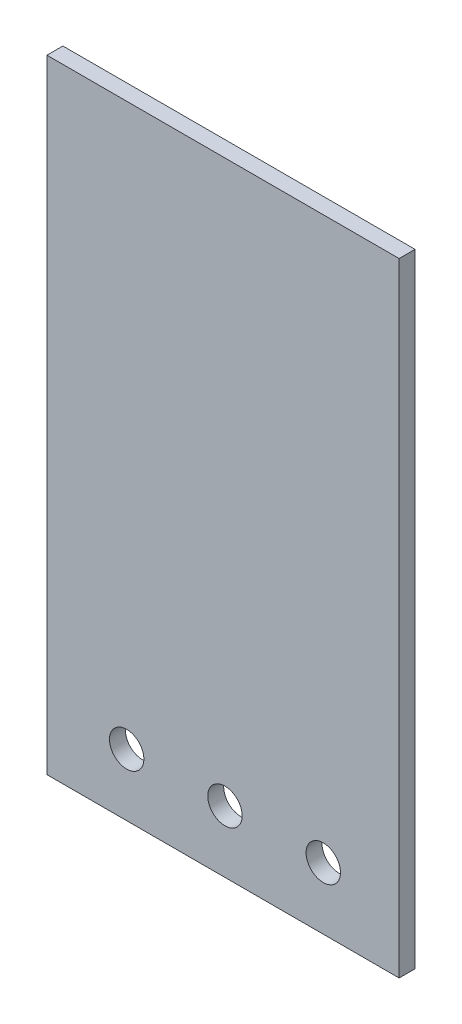
ISO-10303-21;
HEADER;
FILE_DESCRIPTION(('STEP AP214'),'2;1');
FILE_NAME('part.step','',(''),(''),'','','');
FILE_SCHEMA(('AUTOMOTIVE_DESIGN { 1 0 10303 214 1 1 1 1 }'));
ENDSEC;
DATA;
#1=APPLICATION_CONTEXT('core data for automotive mechanical design processes');
#2=APPLICATION_PROTOCOL_DEFINITION('international standard','automotive_design',2000,#1);
#3=PRODUCT_CONTEXT('',#1,'mechanical');
#4=PRODUCT('Part','Part','',(#3));
#5=PRODUCT_RELATED_PRODUCT_CATEGORY('part','',(#4));
#6=PRODUCT_DEFINITION_FORMATION('','',#4);
#7=PRODUCT_DEFINITION_CONTEXT('part definition',#1,'design');
#8=PRODUCT_DEFINITION('design','',#6,#7);
#9=PRODUCT_DEFINITION_SHAPE('','',#8);
#10=(LENGTH_UNIT() NAMED_UNIT(*) SI_UNIT(.MILLI.,.METRE.));
#11=(NAMED_UNIT(*) PLANE_ANGLE_UNIT() SI_UNIT($,.RADIAN.));
#12=(NAMED_UNIT(*) SI_UNIT($,.STERADIAN.) SOLID_ANGLE_UNIT());
#13=UNCERTAINTY_MEASURE_WITH_UNIT(LENGTH_MEASURE(1.E-05),#10,'distance_accuracy_value','');
#14=(GEOMETRIC_REPRESENTATION_CONTEXT(3) GLOBAL_UNCERTAINTY_ASSIGNED_CONTEXT((#13)) GLOBAL_UNIT_ASSIGNED_CONTEXT((#10,
#11,#12)) REPRESENTATION_CONTEXT('',''));
#15=CARTESIAN_POINT('',(0.,0.,0.));
#16=DIRECTION('',(0.,0.,1.));
#17=DIRECTION('',(1.,0.,0.));
#18=AXIS2_PLACEMENT_3D('',#15,#16,#17);
#19=CARTESIAN_POINT('',(0.,0.,0.41148));
#20=DIRECTION('',(0.,0.,-1.));
#21=DIRECTION('',(-1.,0.,0.));
#22=AXIS2_PLACEMENT_3D('',#19,#20,#21);
#23=PLANE('',#22);
#24=CARTESIAN_POINT('',(7.14000096,1.59999934,0.41148));
#25=DIRECTION('',(0.,0.,-1.));
#26=DIRECTION('',(-1.,0.,0.));
#27=AXIS2_PLACEMENT_3D('',#24,#25,#26);
#28=CIRCLE('',#27,0.4445);
#29=CARTESIAN_POINT('',(6.69550096,1.59999934,0.41148));
#30=VERTEX_POINT('',#29);
#31=EDGE_CURVE('E94',#30,#30,#28,.T.);
#32=ORIENTED_EDGE('',*,*,#31,.T.);
#33=EDGE_LOOP('',(#32));
#34=FACE_BOUND('',#33,.T.);
#35=CARTESIAN_POINT('',(4.60000096,1.59999934,0.41148));
#36=DIRECTION('',(0.,0.,-1.));
#37=DIRECTION('',(-1.,0.,0.));
#38=AXIS2_PLACEMENT_3D('',#35,#36,#37);
#39=CIRCLE('',#38,0.4445);
#40=CARTESIAN_POINT('',(4.15550096,1.59999934,0.41148));
#41=VERTEX_POINT('',#40);
#42=EDGE_CURVE('E97',#41,#41,#39,.T.);
#43=ORIENTED_EDGE('',*,*,#42,.T.);
#44=EDGE_LOOP('',(#43));
#45=FACE_BOUND('',#44,.T.);
#46=CARTESIAN_POINT('',(2.06000096,1.59999934,0.41148));
#47=DIRECTION('',(0.,0.,-1.));
#48=DIRECTION('',(-1.,0.,0.));
#49=AXIS2_PLACEMENT_3D('',#46,#47,#48);
#50=CIRCLE('',#49,0.4445);
#51=CARTESIAN_POINT('',(1.61550096,1.59999934,0.41148));
#52=VERTEX_POINT('',#51);
#53=EDGE_CURVE('E100',#52,#52,#50,.T.);
#54=ORIENTED_EDGE('',*,*,#53,.T.);
#55=EDGE_LOOP('',(#54));
#56=FACE_BOUND('',#55,.T.);
#57=DIRECTION('',(-1.57763917375398E-07,0.999999999999988,0.));
#58=VECTOR('',#57,1.);
#59=CARTESIAN_POINT('',(9.09999957999857,1.43565158185507E-06,0.41148));
#60=LINE('',#59,#58);
#61=CARTESIAN_POINT('',(9.09999958,-7.61999999999777E-06,0.41148));
#62=VERTEX_POINT('',#61);
#63=CARTESIAN_POINT('',(9.09999704,16.09999828,0.41148));
#64=VERTEX_POINT('',#63);
#65=EDGE_CURVE('E58',#62,#64,#60,.T.);
#66=ORIENTED_EDGE('',*,*,#65,.T.);
#67=DIRECTION('',(-0.999999999999649,8.37362675800606E-07,0.));
#68=VECTOR('',#67,1.);
#69=CARTESIAN_POINT('',(1.3481544020823E-05,16.1000058999866,0.41148));
#70=LINE('',#69,#68);
#71=CARTESIAN_POINT('',(-2.5400000001295E-06,16.1000059,0.41148));
#72=VERTEX_POINT('',#71);
#73=EDGE_CURVE('E55',#64,#72,#70,.T.);
#74=ORIENTED_EDGE('',*,*,#73,.T.);
#75=DIRECTION('',(1.57763917341198E-07,-0.999999999999988,0.));
#76=VECTOR('',#75,1.);
#77=CARTESIAN_POINT('',(0.,0.,0.41148));
#78=LINE('',#77,#76);
#79=CARTESIAN_POINT('',(0.,0.,0.41148));
#80=VERTEX_POINT('',#79);
#81=EDGE_CURVE('E19',#72,#80,#78,.T.);
#82=ORIENTED_EDGE('',*,*,#81,.T.);
#83=DIRECTION('',(0.999999999999649,-8.37362676009606E-07,0.));
#84=VECTOR('',#83,1.);
#85=CARTESIAN_POINT('',(0.,0.,0.41148));
#86=LINE('',#85,#84);
#87=EDGE_CURVE('E103',#80,#62,#86,.T.);
#88=ORIENTED_EDGE('',*,*,#87,.T.);
#89=EDGE_LOOP('',(#66,#74,#82,#88));
#90=FACE_BOUND('',#89,.T.);
#91=ADVANCED_FACE('F16',(#34,#45,#56,#90),#23,.F.);
#92=CARTESIAN_POINT('',(-2.54E-06,16.1000059,0.));
#93=DIRECTION('',(0.999999999999988,1.57763917341198E-07,0.));
#94=DIRECTION('',(-1.57763917341198E-07,0.999999999999988,0.));
#95=AXIS2_PLACEMENT_3D('',#92,#93,#94);
#96=PLANE('',#95);
#97=DIRECTION('',(0.,0.,1.));
#98=VECTOR('',#97,1.);
#99=CARTESIAN_POINT('',(0.,0.,0.));
#100=LINE('',#99,#98);
#101=CARTESIAN_POINT('',(0.,0.,0.));
#102=VERTEX_POINT('',#101);
#103=EDGE_CURVE('E67',#102,#80,#100,.T.);
#104=ORIENTED_EDGE('',*,*,#103,.T.);
#105=ORIENTED_EDGE('',*,*,#81,.F.);
#106=DIRECTION('',(0.,0.,1.));
#107=VECTOR('',#106,1.);
#108=CARTESIAN_POINT('',(-2.540000000259E-06,16.1000059,0.));
#109=LINE('',#108,#107);
#110=CARTESIAN_POINT('',(-2.54000000019425E-06,16.1000059,0.));
#111=VERTEX_POINT('',#110);
#112=EDGE_CURVE('E62',#72,#111,#109,.F.);
#113=ORIENTED_EDGE('',*,*,#112,.T.);
#114=DIRECTION('',(-1.57763917341198E-07,0.999999999999988,0.));
#115=VECTOR('',#114,1.);
#116=CARTESIAN_POINT('',(-2.54E-06,16.1000059,0.));
#117=LINE('',#116,#115);
#118=EDGE_CURVE('E92',#102,#111,#117,.T.);
#119=ORIENTED_EDGE('',*,*,#118,.F.);
#120=EDGE_LOOP('',(#104,#105,#113,#119));
#121=FACE_BOUND('',#120,.T.);
#122=ADVANCED_FACE('F64',(#121),#96,.F.);
#123=CARTESIAN_POINT('',(9.09999704,16.09999828,0.));
#124=DIRECTION('',(-8.37362675800606E-07,-0.999999999999649,0.));
#125=DIRECTION('',(0.999999999999649,-8.37362675800606E-07,0.));
#126=AXIS2_PLACEMENT_3D('',#123,#124,#125);
#127=PLANE('',#126);
#128=ORIENTED_EDGE('',*,*,#112,.F.);
#129=ORIENTED_EDGE('',*,*,#73,.F.);
#130=DIRECTION('',(0.,0.,1.));
#131=VECTOR('',#130,1.);
#132=CARTESIAN_POINT('',(9.09999704,16.09999828,0.));
#133=LINE('',#132,#131);
#134=CARTESIAN_POINT('',(9.09999704,16.09999828,0.));
#135=VERTEX_POINT('',#134);
#136=EDGE_CURVE('E75',#64,#135,#133,.F.);
#137=ORIENTED_EDGE('',*,*,#136,.T.);
#138=DIRECTION('',(0.999999999999649,-8.37362675800606E-07,0.));
#139=VECTOR('',#138,1.);
#140=CARTESIAN_POINT('',(9.09999704,16.09999828,0.));
#141=LINE('',#140,#139);
#142=EDGE_CURVE('E71',#111,#135,#141,.T.);
#143=ORIENTED_EDGE('',*,*,#142,.F.);
#144=EDGE_LOOP('',(#128,#129,#137,#143));
#145=FACE_BOUND('',#144,.T.);
#146=ADVANCED_FACE('F69',(#145),#127,.F.);
#147=CARTESIAN_POINT('',(9.09999958,-7.62E-06,0.));
#148=DIRECTION('',(-0.999999999999988,-1.57763917375398E-07,0.));
#149=DIRECTION('',(1.57763917375398E-07,-0.999999999999988,0.));
#150=AXIS2_PLACEMENT_3D('',#147,#148,#149);
#151=PLANE('',#150);
#152=ORIENTED_EDGE('',*,*,#136,.F.);
#153=ORIENTED_EDGE('',*,*,#65,.F.);
#154=DIRECTION('',(0.,0.,1.));
#155=VECTOR('',#154,1.);
#156=CARTESIAN_POINT('',(9.09999958,-7.61999999999777E-06,0.));
#157=LINE('',#156,#155);
#158=CARTESIAN_POINT('',(9.09999958,-7.61999999999777E-06,0.));
#159=VERTEX_POINT('',#158);
#160=EDGE_CURVE('E34',#62,#159,#157,.F.);
#161=ORIENTED_EDGE('',*,*,#160,.T.);
#162=DIRECTION('',(1.57763917375398E-07,-0.999999999999988,0.));
#163=VECTOR('',#162,1.);
#164=CARTESIAN_POINT('',(9.09999958,-7.62E-06,0.));
#165=LINE('',#164,#163);
#166=EDGE_CURVE('E88',#135,#159,#165,.T.);
#167=ORIENTED_EDGE('',*,*,#166,.F.);
#168=EDGE_LOOP('',(#152,#153,#161,#167));
#169=FACE_BOUND('',#168,.T.);
#170=ADVANCED_FACE('F105',(#169),#151,.F.);
#171=CARTESIAN_POINT('',(0.,0.,0.));
#172=DIRECTION('',(8.37362676009606E-07,0.999999999999649,0.));
#173=DIRECTION('',(-0.999999999999649,8.37362676009606E-07,0.));
#174=AXIS2_PLACEMENT_3D('',#171,#172,#173);
#175=PLANE('',#174);
#176=ORIENTED_EDGE('',*,*,#160,.F.);
#177=ORIENTED_EDGE('',*,*,#87,.F.);
#178=ORIENTED_EDGE('',*,*,#103,.F.);
#179=DIRECTION('',(-0.999999999999649,8.37362676009606E-07,0.));
#180=VECTOR('',#179,1.);
#181=CARTESIAN_POINT('',(0.,0.,0.));
#182=LINE('',#181,#180);
#183=EDGE_CURVE('E85',#159,#102,#182,.T.);
#184=ORIENTED_EDGE('',*,*,#183,.F.);
#185=EDGE_LOOP('',(#176,#177,#178,#184));
#186=FACE_BOUND('',#185,.T.);
#187=ADVANCED_FACE('F109',(#186),#175,.F.);
#188=CARTESIAN_POINT('',(2.06000096,1.59999934,0.));
#189=DIRECTION('',(0.,0.,-1.));
#190=DIRECTION('',(-1.,0.,0.));
#191=AXIS2_PLACEMENT_3D('',#188,#189,#190);
#192=CYLINDRICAL_SURFACE('',#191,0.4445);
#193=ORIENTED_EDGE('',*,*,#53,.F.);
#194=EDGE_LOOP('',(#193));
#195=FACE_BOUND('',#194,.T.);
#196=CARTESIAN_POINT('',(2.06000096,1.59999934,0.));
#197=DIRECTION('',(0.,0.,-1.));
#198=DIRECTION('',(-1.,0.,0.));
#199=AXIS2_PLACEMENT_3D('',#196,#197,#198);
#200=CIRCLE('',#199,0.4445);
#201=CARTESIAN_POINT('',(1.61550096,1.59999934,0.));
#202=VERTEX_POINT('',#201);
#203=EDGE_CURVE('E82',#202,#202,#200,.F.);
#204=ORIENTED_EDGE('',*,*,#203,.F.);
#205=EDGE_LOOP('',(#204));
#206=FACE_BOUND('',#205,.T.);
#207=ADVANCED_FACE('F111',(#195,#206),#192,.F.);
#208=CARTESIAN_POINT('',(4.60000096,1.59999934,0.));
#209=DIRECTION('',(0.,0.,-1.));
#210=DIRECTION('',(-1.,0.,0.));
#211=AXIS2_PLACEMENT_3D('',#208,#209,#210);
#212=CYLINDRICAL_SURFACE('',#211,0.4445);
#213=ORIENTED_EDGE('',*,*,#42,.F.);
#214=EDGE_LOOP('',(#213));
#215=FACE_BOUND('',#214,.T.);
#216=CARTESIAN_POINT('',(4.60000096,1.59999934,0.));
#217=DIRECTION('',(0.,0.,-1.));
#218=DIRECTION('',(-1.,0.,0.));
#219=AXIS2_PLACEMENT_3D('',#216,#217,#218);
#220=CIRCLE('',#219,0.4445);
#221=CARTESIAN_POINT('',(4.15550096,1.59999934,0.));
#222=VERTEX_POINT('',#221);
#223=EDGE_CURVE('E25',#222,#222,#220,.F.);
#224=ORIENTED_EDGE('',*,*,#223,.F.);
#225=EDGE_LOOP('',(#224));
#226=FACE_BOUND('',#225,.T.);
#227=ADVANCED_FACE('F118',(#215,#226),#212,.F.);
#228=CARTESIAN_POINT('',(7.14000096,1.59999934,0.));
#229=DIRECTION('',(0.,0.,-1.));
#230=DIRECTION('',(-1.,0.,0.));
#231=AXIS2_PLACEMENT_3D('',#228,#229,#230);
#232=CYLINDRICAL_SURFACE('',#231,0.4445);
#233=ORIENTED_EDGE('',*,*,#31,.F.);
#234=EDGE_LOOP('',(#233));
#235=FACE_BOUND('',#234,.T.);
#236=CARTESIAN_POINT('',(7.14000096,1.59999934,0.));
#237=DIRECTION('',(0.,0.,-1.));
#238=DIRECTION('',(-1.,0.,0.));
#239=AXIS2_PLACEMENT_3D('',#236,#237,#238);
#240=CIRCLE('',#239,0.4445);
#241=CARTESIAN_POINT('',(6.69550096,1.59999934,0.));
#242=VERTEX_POINT('',#241);
#243=EDGE_CURVE('E11',#242,#242,#240,.F.);
#244=ORIENTED_EDGE('',*,*,#243,.F.);
#245=EDGE_LOOP('',(#244));
#246=FACE_BOUND('',#245,.T.);
#247=ADVANCED_FACE('F123',(#235,#246),#232,.F.);
#248=CARTESIAN_POINT('',(0.,0.,0.));
#249=DIRECTION('',(0.,0.,-1.));
#250=DIRECTION('',(-1.,0.,0.));
#251=AXIS2_PLACEMENT_3D('',#248,#249,#250);
#252=PLANE('',#251);
#253=ORIENTED_EDGE('',*,*,#243,.T.);
#254=EDGE_LOOP('',(#253));
#255=FACE_BOUND('',#254,.T.);
#256=ORIENTED_EDGE('',*,*,#223,.T.);
#257=EDGE_LOOP('',(#256));
#258=FACE_BOUND('',#257,.T.);
#259=ORIENTED_EDGE('',*,*,#203,.T.);
#260=EDGE_LOOP('',(#259));
#261=FACE_BOUND('',#260,.T.);
#262=ORIENTED_EDGE('',*,*,#166,.T.);
#263=ORIENTED_EDGE('',*,*,#183,.T.);
#264=ORIENTED_EDGE('',*,*,#118,.T.);
#265=ORIENTED_EDGE('',*,*,#142,.T.);
#266=EDGE_LOOP('',(#262,#263,#264,#265));
#267=FACE_BOUND('',#266,.T.);
#268=ADVANCED_FACE('F107',(#255,#258,#261,#267),#252,.T.);
#269=CLOSED_SHELL('',(#91,#122,#146,#170,#187,#207,#227,#247,#268));
#270=MANIFOLD_SOLID_BREP('B1',#269);
#271=ADVANCED_BREP_SHAPE_REPRESENTATION('',(#18,#270),#14);
#272=SHAPE_DEFINITION_REPRESENTATION(#9,#271);
ENDSEC;
END-ISO-10303-21;
